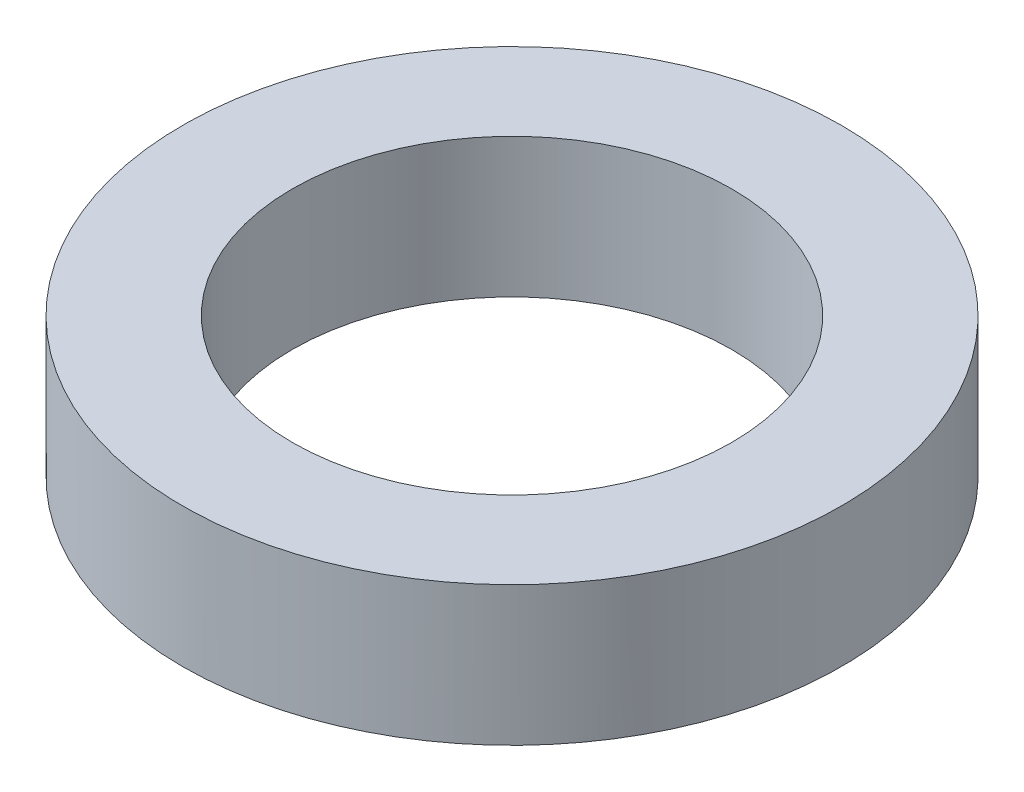
ISO-10303-21;
HEADER;
FILE_DESCRIPTION(('STEP AP214'),'2;1');
FILE_NAME('part.step','',(''),(''),'','','');
FILE_SCHEMA(('AUTOMOTIVE_DESIGN { 1 0 10303 214 1 1 1 1 }'));
ENDSEC;
DATA;
#1=APPLICATION_CONTEXT('core data for automotive mechanical design processes');
#2=APPLICATION_PROTOCOL_DEFINITION('international standard','automotive_design',2000,#1);
#3=PRODUCT_CONTEXT('',#1,'mechanical');
#4=PRODUCT('Part','Part','',(#3));
#5=PRODUCT_RELATED_PRODUCT_CATEGORY('part','',(#4));
#6=PRODUCT_DEFINITION_FORMATION('','',#4);
#7=PRODUCT_DEFINITION_CONTEXT('part definition',#1,'design');
#8=PRODUCT_DEFINITION('design','',#6,#7);
#9=PRODUCT_DEFINITION_SHAPE('','',#8);
#10=(LENGTH_UNIT() NAMED_UNIT(*) SI_UNIT(.MILLI.,.METRE.));
#11=(NAMED_UNIT(*) PLANE_ANGLE_UNIT() SI_UNIT($,.RADIAN.));
#12=(NAMED_UNIT(*) SI_UNIT($,.STERADIAN.) SOLID_ANGLE_UNIT());
#13=UNCERTAINTY_MEASURE_WITH_UNIT(LENGTH_MEASURE(1.E-05),#10,'distance_accuracy_value','');
#14=(GEOMETRIC_REPRESENTATION_CONTEXT(3) GLOBAL_UNCERTAINTY_ASSIGNED_CONTEXT((#13)) GLOBAL_UNIT_ASSIGNED_CONTEXT((#10,
#11,#12)) REPRESENTATION_CONTEXT('',''));
#15=CARTESIAN_POINT('',(0.,0.,0.));
#16=DIRECTION('',(0.,0.,1.));
#17=DIRECTION('',(1.,0.,0.));
#18=AXIS2_PLACEMENT_3D('',#15,#16,#17);
#19=CARTESIAN_POINT('',(0.,0.,0.));
#20=DIRECTION('',(0.,1.,0.));
#21=DIRECTION('',(0.,0.,1.));
#22=AXIS2_PLACEMENT_3D('',#19,#20,#21);
#23=PLANE('',#22);
#24=CARTESIAN_POINT('',(0.,0.,0.));
#25=DIRECTION('',(0.,1.,0.));
#26=DIRECTION('',(0.,0.,1.));
#27=AXIS2_PLACEMENT_3D('',#24,#25,#26);
#28=CIRCLE('',#27,11.43);
#29=CARTESIAN_POINT('',(0.,0.,11.43));
#30=VERTEX_POINT('',#29);
#31=EDGE_CURVE('E38',#30,#30,#28,.T.);
#32=ORIENTED_EDGE('',*,*,#31,.F.);
#33=EDGE_LOOP('',(#32));
#34=FACE_BOUND('',#33,.T.);
#35=CARTESIAN_POINT('',(0.,0.,0.));
#36=DIRECTION('',(0.,1.,0.));
#37=DIRECTION('',(0.,0.,1.));
#38=AXIS2_PLACEMENT_3D('',#35,#36,#37);
#39=CIRCLE('',#38,7.62);
#40=CARTESIAN_POINT('',(0.,0.,7.62));
#41=VERTEX_POINT('',#40);
#42=EDGE_CURVE('E47',#41,#41,#39,.T.);
#43=ORIENTED_EDGE('',*,*,#42,.T.);
#44=EDGE_LOOP('',(#43));
#45=FACE_BOUND('',#44,.T.);
#46=ADVANCED_FACE('F31',(#34,#45),#23,.F.);
#47=CARTESIAN_POINT('',(0.,37.154922035849,0.));
#48=DIRECTION('',(0.,-1.,0.));
#49=DIRECTION('',(0.,0.,-1.));
#50=AXIS2_PLACEMENT_3D('',#47,#48,#49);
#51=CYLINDRICAL_SURFACE('',#50,11.43);
#52=CARTESIAN_POINT('',(0.,4.82600000000002,0.));
#53=DIRECTION('',(0.,-1.,0.));
#54=DIRECTION('',(0.,0.,-1.));
#55=AXIS2_PLACEMENT_3D('',#52,#53,#54);
#56=CIRCLE('',#55,11.43);
#57=CARTESIAN_POINT('',(0.,4.82600000000002,-11.43));
#58=VERTEX_POINT('',#57);
#59=EDGE_CURVE('E42',#58,#58,#56,.T.);
#60=ORIENTED_EDGE('',*,*,#59,.T.);
#61=EDGE_LOOP('',(#60));
#62=FACE_BOUND('',#61,.T.);
#63=ORIENTED_EDGE('',*,*,#31,.T.);
#64=EDGE_LOOP('',(#63));
#65=FACE_BOUND('',#64,.T.);
#66=ADVANCED_FACE('F55',(#62,#65),#51,.T.);
#67=CARTESIAN_POINT('',(0.,37.154922035849,0.));
#68=DIRECTION('',(0.,-1.,0.));
#69=DIRECTION('',(0.,0.,-1.));
#70=AXIS2_PLACEMENT_3D('',#67,#68,#69);
#71=CYLINDRICAL_SURFACE('',#70,7.62);
#72=CARTESIAN_POINT('',(0.,4.82600000000002,0.));
#73=DIRECTION('',(0.,-1.,0.));
#74=DIRECTION('',(0.,0.,-1.));
#75=AXIS2_PLACEMENT_3D('',#72,#73,#74);
#76=CIRCLE('',#75,7.62);
#77=CARTESIAN_POINT('',(0.,4.82600000000002,-7.62));
#78=VERTEX_POINT('',#77);
#79=EDGE_CURVE('E10',#78,#78,#76,.T.);
#80=ORIENTED_EDGE('',*,*,#79,.F.);
#81=EDGE_LOOP('',(#80));
#82=FACE_BOUND('',#81,.T.);
#83=ORIENTED_EDGE('',*,*,#42,.F.);
#84=EDGE_LOOP('',(#83));
#85=FACE_BOUND('',#84,.T.);
#86=ADVANCED_FACE('F53',(#82,#85),#71,.F.);
#87=CARTESIAN_POINT('',(6.35,4.82600000000002,0.));
#88=DIRECTION('',(0.,-1.,0.));
#89=DIRECTION('',(1.,0.,0.));
#90=AXIS2_PLACEMENT_3D('',#87,#88,#89);
#91=PLANE('',#90);
#92=ORIENTED_EDGE('',*,*,#79,.T.);
#93=EDGE_LOOP('',(#92));
#94=FACE_BOUND('',#93,.T.);
#95=ORIENTED_EDGE('',*,*,#59,.F.);
#96=EDGE_LOOP('',(#95));
#97=FACE_BOUND('',#96,.T.);
#98=ADVANCED_FACE('F33',(#94,#97),#91,.F.);
#99=CLOSED_SHELL('',(#46,#66,#86,#98));
#100=MANIFOLD_SOLID_BREP('B2',#99);
#101=ADVANCED_BREP_SHAPE_REPRESENTATION('',(#18,#100),#14);
#102=SHAPE_DEFINITION_REPRESENTATION(#9,#101);
ENDSEC;
END-ISO-10303-21;
